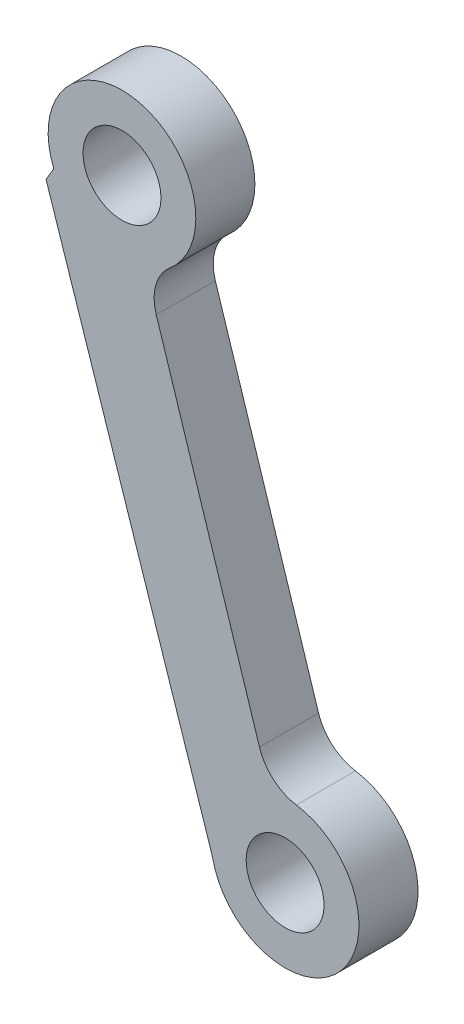
ISO-10303-21;
HEADER;
FILE_DESCRIPTION(('STEP AP214'),'2;1');
FILE_NAME('part.step','',(''),(''),'','','');
FILE_SCHEMA(('AUTOMOTIVE_DESIGN { 1 0 10303 214 1 1 1 1 }'));
ENDSEC;
DATA;
#1=APPLICATION_CONTEXT('core data for automotive mechanical design processes');
#2=APPLICATION_PROTOCOL_DEFINITION('international standard','automotive_design',2000,#1);
#3=PRODUCT_CONTEXT('',#1,'mechanical');
#4=PRODUCT('Part','Part','',(#3));
#5=PRODUCT_RELATED_PRODUCT_CATEGORY('part','',(#4));
#6=PRODUCT_DEFINITION_FORMATION('','',#4);
#7=PRODUCT_DEFINITION_CONTEXT('part definition',#1,'design');
#8=PRODUCT_DEFINITION('design','',#6,#7);
#9=PRODUCT_DEFINITION_SHAPE('','',#8);
#10=(LENGTH_UNIT() NAMED_UNIT(*) SI_UNIT(.MILLI.,.METRE.));
#11=(NAMED_UNIT(*) PLANE_ANGLE_UNIT() SI_UNIT($,.RADIAN.));
#12=(NAMED_UNIT(*) SI_UNIT($,.STERADIAN.) SOLID_ANGLE_UNIT());
#13=UNCERTAINTY_MEASURE_WITH_UNIT(LENGTH_MEASURE(1.E-05),#10,'distance_accuracy_value','');
#14=(GEOMETRIC_REPRESENTATION_CONTEXT(3) GLOBAL_UNCERTAINTY_ASSIGNED_CONTEXT((#13)) GLOBAL_UNIT_ASSIGNED_CONTEXT((#10,
#11,#12)) REPRESENTATION_CONTEXT('',''));
#15=CARTESIAN_POINT('',(0.,0.,0.));
#16=DIRECTION('',(0.,0.,1.));
#17=DIRECTION('',(1.,0.,0.));
#18=AXIS2_PLACEMENT_3D('',#15,#16,#17);
#19=CARTESIAN_POINT('',(19.8561963211169,50.4190268246602,0.));
#20=DIRECTION('',(0.,0.,1.));
#21=DIRECTION('',(1.,0.,0.));
#22=AXIS2_PLACEMENT_3D('',#19,#20,#21);
#23=CYLINDRICAL_SURFACE('',#22,5.);
#24=CARTESIAN_POINT('',(19.8561963211169,50.4190268246602,4.));
#25=DIRECTION('',(0.,0.,1.));
#26=DIRECTION('',(1.,0.,0.));
#27=AXIS2_PLACEMENT_3D('',#24,#25,#26);
#28=CIRCLE('',#27,5.);
#29=CARTESIAN_POINT('',(15.1184678977643,48.8209250173409,4.));
#30=VERTEX_POINT('',#29);
#31=CARTESIAN_POINT('',(20.6226615504409,55.3599306946254,4.));
#32=VERTEX_POINT('',#31);
#33=EDGE_CURVE('E130',#30,#32,#28,.T.);
#34=ORIENTED_EDGE('',*,*,#33,.F.);
#35=DIRECTION('',(0.,0.,1.));
#36=VECTOR('',#35,1.);
#37=CARTESIAN_POINT('',(15.1184678977643,48.8209250173409,0.));
#38=LINE('',#37,#36);
#39=CARTESIAN_POINT('',(15.1184678977643,48.8209250173409,0.));
#40=VERTEX_POINT('',#39);
#41=EDGE_CURVE('E11',#40,#30,#38,.T.);
#42=ORIENTED_EDGE('',*,*,#41,.F.);
#43=CARTESIAN_POINT('',(19.8561963211169,50.4190268246602,0.));
#44=DIRECTION('',(0.,0.,1.));
#45=DIRECTION('',(1.,0.,0.));
#46=AXIS2_PLACEMENT_3D('',#43,#44,#45);
#47=CIRCLE('',#46,5.);
#48=CARTESIAN_POINT('',(20.6226615504409,55.3599306946254,0.));
#49=VERTEX_POINT('',#48);
#50=EDGE_CURVE('E151',#40,#49,#47,.T.);
#51=ORIENTED_EDGE('',*,*,#50,.T.);
#52=DIRECTION('',(0.,0.,1.));
#53=VECTOR('',#52,1.);
#54=CARTESIAN_POINT('',(20.6226615504409,55.3599306946254,0.));
#55=LINE('',#54,#53);
#56=EDGE_CURVE('E36',#49,#32,#55,.T.);
#57=ORIENTED_EDGE('',*,*,#56,.T.);
#58=EDGE_LOOP('',(#34,#42,#51,#57));
#59=FACE_BOUND('',#58,.T.);
#60=ADVANCED_FACE('F33',(#59),#23,.T.);
#61=CARTESIAN_POINT('',(14.8418535218836,49.7794626288614,0.));
#62=DIRECTION('',(-0.960793384630325,-0.277265345924448,0.));
#63=DIRECTION('',(0.277265345924448,-0.960793384630325,0.));
#64=AXIS2_PLACEMENT_3D('',#61,#62,#63);
#65=PLANE('',#64);
#66=DIRECTION('',(0.277265345924448,-0.960793384630325,0.));
#67=VECTOR('',#66,1.);
#68=CARTESIAN_POINT('',(14.8418535218836,49.7794626288614,4.));
#69=LINE('',#68,#67);
#70=CARTESIAN_POINT('',(14.8418535218836,49.7794626288614,4.));
#71=VERTEX_POINT('',#70);
#72=EDGE_CURVE('E149',#71,#30,#69,.T.);
#73=ORIENTED_EDGE('',*,*,#72,.F.);
#74=DIRECTION('',(0.,0.,1.));
#75=VECTOR('',#74,1.);
#76=CARTESIAN_POINT('',(14.8418535218836,49.7794626288614,0.));
#77=LINE('',#76,#75);
#78=CARTESIAN_POINT('',(14.8418535218836,49.7794626288614,0.));
#79=VERTEX_POINT('',#78);
#80=EDGE_CURVE('E42',#79,#71,#77,.T.);
#81=ORIENTED_EDGE('',*,*,#80,.F.);
#82=DIRECTION('',(0.277265345924448,-0.960793384630325,0.));
#83=VECTOR('',#82,1.);
#84=CARTESIAN_POINT('',(14.8418535218836,49.7794626288614,0.));
#85=LINE('',#84,#83);
#86=EDGE_CURVE('E120',#79,#40,#85,.T.);
#87=ORIENTED_EDGE('',*,*,#86,.T.);
#88=ORIENTED_EDGE('',*,*,#41,.T.);
#89=EDGE_LOOP('',(#73,#81,#87,#88));
#90=FACE_BOUND('',#89,.T.);
#91=ADVANCED_FACE('F163',(#90),#65,.T.);
#92=CARTESIAN_POINT('',(3.66949253805064,83.5717020763536,0.));
#93=DIRECTION('',(-0.949453564490203,-0.313907516438917,0.));
#94=DIRECTION('',(0.313907516438917,-0.949453564490203,0.));
#95=AXIS2_PLACEMENT_3D('',#92,#93,#94);
#96=PLANE('',#95);
#97=DIRECTION('',(0.313907516438917,-0.949453564490202,0.));
#98=VECTOR('',#97,1.);
#99=CARTESIAN_POINT('',(3.66949253805064,83.5717020763536,4.));
#100=LINE('',#99,#98);
#101=CARTESIAN_POINT('',(3.66949253805064,83.5717020763536,4.));
#102=VERTEX_POINT('',#101);
#103=EDGE_CURVE('E107',#102,#71,#100,.T.);
#104=ORIENTED_EDGE('',*,*,#103,.F.);
#105=DIRECTION('',(0.,0.,1.));
#106=VECTOR('',#105,1.);
#107=CARTESIAN_POINT('',(3.66949253805064,83.5717020763536,0.));
#108=LINE('',#107,#106);
#109=CARTESIAN_POINT('',(3.66949253805064,83.5717020763536,0.));
#110=VERTEX_POINT('',#109);
#111=EDGE_CURVE('E102',#110,#102,#108,.T.);
#112=ORIENTED_EDGE('',*,*,#111,.F.);
#113=DIRECTION('',(0.313907516438917,-0.949453564490202,0.));
#114=VECTOR('',#113,1.);
#115=CARTESIAN_POINT('',(3.66949253805064,83.5717020763536,0.));
#116=LINE('',#115,#114);
#117=EDGE_CURVE('E105',#110,#79,#116,.T.);
#118=ORIENTED_EDGE('',*,*,#117,.T.);
#119=ORIENTED_EDGE('',*,*,#80,.T.);
#120=EDGE_LOOP('',(#104,#112,#118,#119));
#121=FACE_BOUND('',#120,.T.);
#122=ADVANCED_FACE('F104',(#121),#96,.T.);
#123=CARTESIAN_POINT('',(4.19198680850157,84.4585709172422,0.));
#124=DIRECTION('',(-0.861591516947737,0.507602263513174,0.));
#125=DIRECTION('',(-0.507602263513174,-0.861591516947737,0.));
#126=AXIS2_PLACEMENT_3D('',#123,#124,#125);
#127=PLANE('',#126);
#128=DIRECTION('',(-0.507602263513174,-0.861591516947737,0.));
#129=VECTOR('',#128,1.);
#130=CARTESIAN_POINT('',(4.19198680850157,84.4585709172422,4.));
#131=LINE('',#130,#129);
#132=CARTESIAN_POINT('',(4.19198680850157,84.4585709172422,4.));
#133=VERTEX_POINT('',#132);
#134=EDGE_CURVE('E146',#133,#102,#131,.T.);
#135=ORIENTED_EDGE('',*,*,#134,.F.);
#136=DIRECTION('',(0.,0.,1.));
#137=VECTOR('',#136,1.);
#138=CARTESIAN_POINT('',(4.19198680850157,84.4585709172422,0.));
#139=LINE('',#138,#137);
#140=CARTESIAN_POINT('',(4.19198680850157,84.4585709172422,0.));
#141=VERTEX_POINT('',#140);
#142=EDGE_CURVE('E112',#141,#133,#139,.T.);
#143=ORIENTED_EDGE('',*,*,#142,.F.);
#144=DIRECTION('',(-0.507602263513174,-0.861591516947737,0.));
#145=VECTOR('',#144,1.);
#146=CARTESIAN_POINT('',(4.19198680850157,84.4585709172422,0.));
#147=LINE('',#146,#145);
#148=EDGE_CURVE('E118',#141,#110,#147,.T.);
#149=ORIENTED_EDGE('',*,*,#148,.T.);
#150=ORIENTED_EDGE('',*,*,#111,.T.);
#151=EDGE_LOOP('',(#135,#143,#149,#150));
#152=FACE_BOUND('',#151,.T.);
#153=ADVANCED_FACE('F122',(#152),#127,.T.);
#154=CARTESIAN_POINT('',(8.81015159822433,86.3749617894196,0.));
#155=DIRECTION('',(0.,0.,1.));
#156=DIRECTION('',(1.,0.,0.));
#157=AXIS2_PLACEMENT_3D('',#154,#155,#156);
#158=CYLINDRICAL_SURFACE('',#157,5.);
#159=CARTESIAN_POINT('',(8.81015159822433,86.3749617894196,4.));
#160=DIRECTION('',(0.,0.,1.));
#161=DIRECTION('',(1.,0.,0.));
#162=AXIS2_PLACEMENT_3D('',#159,#160,#161);
#163=CIRCLE('',#162,5.);
#164=CARTESIAN_POINT('',(12.0463765584466,82.5635515508288,4.));
#165=VERTEX_POINT('',#164);
#166=EDGE_CURVE('E143',#165,#133,#163,.T.);
#167=ORIENTED_EDGE('',*,*,#166,.F.);
#168=DIRECTION('',(0.,0.,1.));
#169=VECTOR('',#168,1.);
#170=CARTESIAN_POINT('',(12.0463765584466,82.5635515508288,0.));
#171=LINE('',#170,#169);
#172=CARTESIAN_POINT('',(12.0463765584466,82.5635515508288,0.));
#173=VERTEX_POINT('',#172);
#174=EDGE_CURVE('E155',#173,#165,#171,.T.);
#175=ORIENTED_EDGE('',*,*,#174,.F.);
#176=CARTESIAN_POINT('',(8.81015159822433,86.3749617894196,0.));
#177=DIRECTION('',(0.,0.,1.));
#178=DIRECTION('',(1.,0.,0.));
#179=AXIS2_PLACEMENT_3D('',#176,#177,#178);
#180=CIRCLE('',#179,5.);
#181=EDGE_CURVE('E123',#173,#141,#180,.T.);
#182=ORIENTED_EDGE('',*,*,#181,.T.);
#183=ORIENTED_EDGE('',*,*,#142,.T.);
#184=EDGE_LOOP('',(#167,#175,#182,#183));
#185=FACE_BOUND('',#184,.T.);
#186=ADVANCED_FACE('F176',(#185),#158,.T.);
#187=CARTESIAN_POINT('',(13.98811153458,80.2767054076744,0.));
#188=DIRECTION('',(0.,0.,1.));
#189=DIRECTION('',(1.,0.,0.));
#190=AXIS2_PLACEMENT_3D('',#187,#188,#189);
#191=CYLINDRICAL_SURFACE('',#190,3.);
#192=CARTESIAN_POINT('',(13.98811153458,80.2767054076744,4.));
#193=DIRECTION('',(0.,0.,-1.));
#194=DIRECTION('',(-1.,0.,0.));
#195=AXIS2_PLACEMENT_3D('',#192,#193,#194);
#196=CIRCLE('',#195,3.);
#197=CARTESIAN_POINT('',(11.1306255678193,79.3630457611069,4.));
#198=VERTEX_POINT('',#197);
#199=EDGE_CURVE('E140',#198,#165,#196,.T.);
#200=ORIENTED_EDGE('',*,*,#199,.F.);
#201=DIRECTION('',(0.,0.,1.));
#202=VECTOR('',#201,1.);
#203=CARTESIAN_POINT('',(11.1306255678193,79.3630457611069,0.));
#204=LINE('',#203,#202);
#205=CARTESIAN_POINT('',(11.1306255678193,79.3630457611069,0.));
#206=VERTEX_POINT('',#205);
#207=EDGE_CURVE('E157',#206,#198,#204,.T.);
#208=ORIENTED_EDGE('',*,*,#207,.F.);
#209=CARTESIAN_POINT('',(13.98811153458,80.2767054076744,0.));
#210=DIRECTION('',(0.,0.,-1.));
#211=DIRECTION('',(-1.,0.,0.));
#212=AXIS2_PLACEMENT_3D('',#209,#210,#211);
#213=CIRCLE('',#212,3.);
#214=EDGE_CURVE('E125',#206,#173,#213,.T.);
#215=ORIENTED_EDGE('',*,*,#214,.T.);
#216=ORIENTED_EDGE('',*,*,#174,.T.);
#217=EDGE_LOOP('',(#200,#208,#215,#216));
#218=FACE_BOUND('',#217,.T.);
#219=ADVANCED_FACE('F179',(#218),#191,.F.);
#220=CARTESIAN_POINT('',(18.1213130379413,57.4995526989704,0.));
#221=DIRECTION('',(0.952495322253554,0.304553215522507,0.));
#222=DIRECTION('',(-0.304553215522507,0.952495322253554,0.));
#223=AXIS2_PLACEMENT_3D('',#220,#221,#222);
#224=PLANE('',#223);
#225=DIRECTION('',(-0.304553215522507,0.952495322253554,0.));
#226=VECTOR('',#225,1.);
#227=CARTESIAN_POINT('',(18.1213130379413,57.4995526989704,4.));
#228=LINE('',#227,#226);
#229=CARTESIAN_POINT('',(18.1213130379413,57.4995526989704,4.));
#230=VERTEX_POINT('',#229);
#231=EDGE_CURVE('E137',#230,#198,#228,.T.);
#232=ORIENTED_EDGE('',*,*,#231,.F.);
#233=DIRECTION('',(0.,0.,1.));
#234=VECTOR('',#233,1.);
#235=CARTESIAN_POINT('',(18.1213130379413,57.4995526989704,0.));
#236=LINE('',#235,#234);
#237=CARTESIAN_POINT('',(18.1213130379413,57.4995526989704,0.));
#238=VERTEX_POINT('',#237);
#239=EDGE_CURVE('E158',#238,#230,#236,.T.);
#240=ORIENTED_EDGE('',*,*,#239,.F.);
#241=DIRECTION('',(-0.304553215522507,0.952495322253554,0.));
#242=VECTOR('',#241,1.);
#243=CARTESIAN_POINT('',(18.1213130379413,57.4995526989704,0.));
#244=LINE('',#243,#242);
#245=EDGE_CURVE('E225',#238,#206,#244,.T.);
#246=ORIENTED_EDGE('',*,*,#245,.T.);
#247=ORIENTED_EDGE('',*,*,#207,.T.);
#248=EDGE_LOOP('',(#232,#240,#246,#247));
#249=FACE_BOUND('',#248,.T.);
#250=ADVANCED_FACE('F183',(#249),#224,.T.);
#251=CARTESIAN_POINT('',(21.1024391281312,58.4527453451004,0.));
#252=DIRECTION('',(0.,0.,1.));
#253=DIRECTION('',(1.,0.,0.));
#254=AXIS2_PLACEMENT_3D('',#251,#252,#253);
#255=CYLINDRICAL_SURFACE('',#254,3.12980654134526);
#256=CARTESIAN_POINT('',(21.1024391281312,58.4527453451004,4.));
#257=DIRECTION('',(0.,0.,-1.));
#258=DIRECTION('',(-1.,0.,0.));
#259=AXIS2_PLACEMENT_3D('',#256,#257,#258);
#260=CIRCLE('',#259,3.12980654134526);
#261=EDGE_CURVE('E133',#32,#230,#260,.T.);
#262=ORIENTED_EDGE('',*,*,#261,.F.);
#263=ORIENTED_EDGE('',*,*,#56,.F.);
#264=CARTESIAN_POINT('',(21.1024391281312,58.4527453451004,0.));
#265=DIRECTION('',(0.,0.,-1.));
#266=DIRECTION('',(-1.,0.,0.));
#267=AXIS2_PLACEMENT_3D('',#264,#265,#266);
#268=CIRCLE('',#267,3.12980654134526);
#269=EDGE_CURVE('E223',#49,#238,#268,.T.);
#270=ORIENTED_EDGE('',*,*,#269,.T.);
#271=ORIENTED_EDGE('',*,*,#239,.T.);
#272=EDGE_LOOP('',(#262,#263,#270,#271));
#273=FACE_BOUND('',#272,.T.);
#274=ADVANCED_FACE('F160',(#273),#255,.F.);
#275=CARTESIAN_POINT('',(19.8561963211169,50.4190268246602,0.));
#276=DIRECTION('',(0.,0.,1.));
#277=DIRECTION('',(1.,0.,0.));
#278=AXIS2_PLACEMENT_3D('',#275,#276,#277);
#279=PLANE('',#278);
#280=CARTESIAN_POINT('',(8.81015159822433,86.3749617894196,0.));
#281=DIRECTION('',(0.,0.,1.));
#282=DIRECTION('',(-1.,0.,0.));
#283=AXIS2_PLACEMENT_3D('',#280,#281,#282);
#284=CIRCLE('',#283,2.6375);
#285=CARTESIAN_POINT('',(6.17265159822433,86.3749617894196,0.));
#286=VERTEX_POINT('',#285);
#287=EDGE_CURVE('E210',#286,#286,#284,.T.);
#288=ORIENTED_EDGE('',*,*,#287,.T.);
#289=EDGE_LOOP('',(#288));
#290=FACE_BOUND('',#289,.T.);
#291=CARTESIAN_POINT('',(19.8561963211169,50.4190268246602,0.));
#292=DIRECTION('',(0.,0.,1.));
#293=DIRECTION('',(-1.,0.,0.));
#294=AXIS2_PLACEMENT_3D('',#291,#292,#293);
#295=CIRCLE('',#294,2.6375);
#296=CARTESIAN_POINT('',(17.2186963211169,50.4190268246602,0.));
#297=VERTEX_POINT('',#296);
#298=EDGE_CURVE('E134',#297,#297,#295,.T.);
#299=ORIENTED_EDGE('',*,*,#298,.T.);
#300=EDGE_LOOP('',(#299));
#301=FACE_BOUND('',#300,.T.);
#302=ORIENTED_EDGE('',*,*,#50,.F.);
#303=ORIENTED_EDGE('',*,*,#86,.F.);
#304=ORIENTED_EDGE('',*,*,#117,.F.);
#305=ORIENTED_EDGE('',*,*,#148,.F.);
#306=ORIENTED_EDGE('',*,*,#181,.F.);
#307=ORIENTED_EDGE('',*,*,#214,.F.);
#308=ORIENTED_EDGE('',*,*,#245,.F.);
#309=ORIENTED_EDGE('',*,*,#269,.F.);
#310=EDGE_LOOP('',(#302,#303,#304,#305,#306,#307,#308,#309));
#311=FACE_BOUND('',#310,.T.);
#312=ADVANCED_FACE('F116',(#290,#301,#311),#279,.F.);
#313=CARTESIAN_POINT('',(19.8561963211169,50.4190268246602,4.));
#314=DIRECTION('',(0.,0.,1.));
#315=DIRECTION('',(1.,0.,0.));
#316=AXIS2_PLACEMENT_3D('',#313,#314,#315);
#317=PLANE('',#316);
#318=CARTESIAN_POINT('',(8.81015159822433,86.3749617894196,4.));
#319=DIRECTION('',(0.,0.,1.));
#320=DIRECTION('',(-1.,0.,0.));
#321=AXIS2_PLACEMENT_3D('',#318,#319,#320);
#322=CIRCLE('',#321,2.6375);
#323=CARTESIAN_POINT('',(6.17265159822433,86.3749617894196,4.));
#324=VERTEX_POINT('',#323);
#325=EDGE_CURVE('E213',#324,#324,#322,.T.);
#326=ORIENTED_EDGE('',*,*,#325,.F.);
#327=EDGE_LOOP('',(#326));
#328=FACE_BOUND('',#327,.T.);
#329=CARTESIAN_POINT('',(19.8561963211169,50.4190268246602,4.));
#330=DIRECTION('',(0.,0.,1.));
#331=DIRECTION('',(-1.,0.,0.));
#332=AXIS2_PLACEMENT_3D('',#329,#330,#331);
#333=CIRCLE('',#332,2.6375);
#334=CARTESIAN_POINT('',(17.2186963211169,50.4190268246602,4.));
#335=VERTEX_POINT('',#334);
#336=EDGE_CURVE('E215',#335,#335,#333,.T.);
#337=ORIENTED_EDGE('',*,*,#336,.F.);
#338=EDGE_LOOP('',(#337));
#339=FACE_BOUND('',#338,.T.);
#340=ORIENTED_EDGE('',*,*,#33,.T.);
#341=ORIENTED_EDGE('',*,*,#261,.T.);
#342=ORIENTED_EDGE('',*,*,#231,.T.);
#343=ORIENTED_EDGE('',*,*,#199,.T.);
#344=ORIENTED_EDGE('',*,*,#166,.T.);
#345=ORIENTED_EDGE('',*,*,#134,.T.);
#346=ORIENTED_EDGE('',*,*,#103,.T.);
#347=ORIENTED_EDGE('',*,*,#72,.T.);
#348=EDGE_LOOP('',(#340,#341,#342,#343,#344,#345,#346,#347));
#349=FACE_BOUND('',#348,.T.);
#350=ADVANCED_FACE('F162',(#328,#339,#349),#317,.T.);
#351=CARTESIAN_POINT('',(19.8561963211169,50.4190268246602,0.));
#352=DIRECTION('',(0.,0.,1.));
#353=DIRECTION('',(1.,0.,0.));
#354=AXIS2_PLACEMENT_3D('',#351,#352,#353);
#355=CYLINDRICAL_SURFACE('',#354,2.6375);
#356=ORIENTED_EDGE('',*,*,#298,.F.);
#357=EDGE_LOOP('',(#356));
#358=FACE_BOUND('',#357,.T.);
#359=ORIENTED_EDGE('',*,*,#336,.T.);
#360=EDGE_LOOP('',(#359));
#361=FACE_BOUND('',#360,.T.);
#362=ADVANCED_FACE('F195',(#358,#361),#355,.F.);
#363=CARTESIAN_POINT('',(8.81015159822433,86.3749617894196,0.));
#364=DIRECTION('',(0.,0.,1.));
#365=DIRECTION('',(1.,0.,0.));
#366=AXIS2_PLACEMENT_3D('',#363,#364,#365);
#367=CYLINDRICAL_SURFACE('',#366,2.6375);
#368=ORIENTED_EDGE('',*,*,#287,.F.);
#369=EDGE_LOOP('',(#368));
#370=FACE_BOUND('',#369,.T.);
#371=ORIENTED_EDGE('',*,*,#325,.T.);
#372=EDGE_LOOP('',(#371));
#373=FACE_BOUND('',#372,.T.);
#374=ADVANCED_FACE('F202',(#370,#373),#367,.F.);
#375=CLOSED_SHELL('',(#60,#91,#122,#153,#186,#219,#250,#274,#312,#350,#362,#374));
#376=MANIFOLD_SOLID_BREP('B2',#375);
#377=ADVANCED_BREP_SHAPE_REPRESENTATION('',(#18,#376),#14);
#378=SHAPE_DEFINITION_REPRESENTATION(#9,#377);
ENDSEC;
END-ISO-10303-21;
